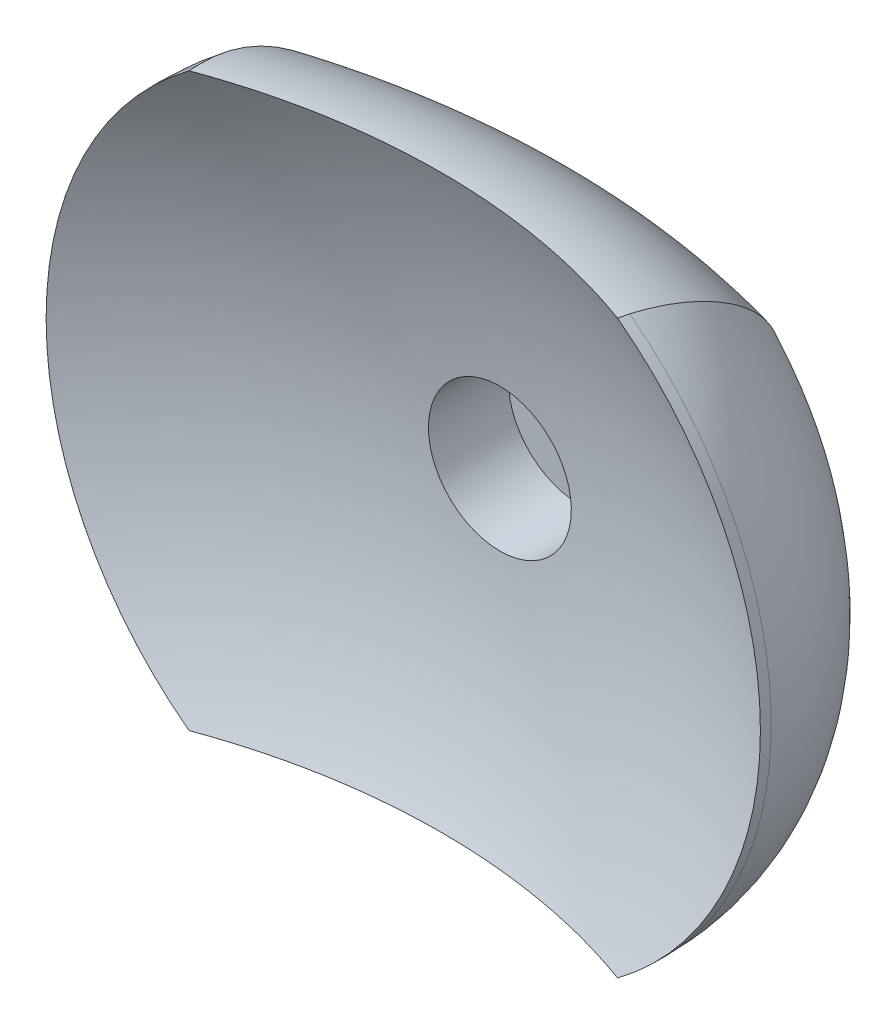
ISO-10303-21;
HEADER;
FILE_DESCRIPTION(('STEP AP214'),'2;1');
FILE_NAME('part.step','',(''),(''),'','','');
FILE_SCHEMA(('AUTOMOTIVE_DESIGN { 1 0 10303 214 1 1 1 1 }'));
ENDSEC;
DATA;
#1=APPLICATION_CONTEXT('core data for automotive mechanical design processes');
#2=APPLICATION_PROTOCOL_DEFINITION('international standard','automotive_design',2000,#1);
#3=PRODUCT_CONTEXT('',#1,'mechanical');
#4=PRODUCT('Part','Part','',(#3));
#5=PRODUCT_RELATED_PRODUCT_CATEGORY('part','',(#4));
#6=PRODUCT_DEFINITION_FORMATION('','',#4);
#7=PRODUCT_DEFINITION_CONTEXT('part definition',#1,'design');
#8=PRODUCT_DEFINITION('design','',#6,#7);
#9=PRODUCT_DEFINITION_SHAPE('','',#8);
#10=(LENGTH_UNIT() NAMED_UNIT(*) SI_UNIT(.MILLI.,.METRE.));
#11=(NAMED_UNIT(*) PLANE_ANGLE_UNIT() SI_UNIT($,.RADIAN.));
#12=(NAMED_UNIT(*) SI_UNIT($,.STERADIAN.) SOLID_ANGLE_UNIT());
#13=UNCERTAINTY_MEASURE_WITH_UNIT(LENGTH_MEASURE(1.E-05),#10,'distance_accuracy_value','');
#14=(GEOMETRIC_REPRESENTATION_CONTEXT(3) GLOBAL_UNCERTAINTY_ASSIGNED_CONTEXT((#13)) GLOBAL_UNIT_ASSIGNED_CONTEXT((#10,
#11,#12)) REPRESENTATION_CONTEXT('',''));
#15=CARTESIAN_POINT('',(0.,0.,0.));
#16=DIRECTION('',(0.,0.,1.));
#17=DIRECTION('',(1.,0.,0.));
#18=AXIS2_PLACEMENT_3D('',#15,#16,#17);
#19=CARTESIAN_POINT('',(0.,0.,85.));
#20=DIRECTION('',(0.,0.,1.));
#21=DIRECTION('',(0.,1.,0.));
#22=AXIS2_PLACEMENT_3D('',#19,#20,#21);
#23=SPHERICAL_SURFACE('',#22,85.);
#24=CARTESIAN_POINT('',(0.,0.,3.13856598679557));
#25=DIRECTION('',(0.,0.,1.));
#26=DIRECTION('',(0.,-1.,0.));
#27=AXIS2_PLACEMENT_3D('',#24,#25,#26);
#28=CIRCLE('',#27,22.8846153846153);
#29=CARTESIAN_POINT('',(-18.7456166701098,-13.1265942635199,3.13856598679554));
#30=VERTEX_POINT('',#29);
#31=CARTESIAN_POINT('',(-18.7456166701099,13.1265942635199,3.13856598679554));
#32=VERTEX_POINT('',#31);
#33=EDGE_CURVE('E272',#30,#32,#28,.F.);
#34=ORIENTED_EDGE('',*,*,#33,.T.);
#35=CARTESIAN_POINT('',(0.,13.1265942635199,85.));
#36=DIRECTION('',(0.,-1.,0.));
#37=DIRECTION('',(0.,0.,-1.));
#38=AXIS2_PLACEMENT_3D('',#35,#36,#37);
#39=CIRCLE('',#38,83.9803103295108);
#40=CARTESIAN_POINT('',(-7.25896156767112,13.1265942635199,1.33399734659243));
#41=VERTEX_POINT('',#40);
#42=EDGE_CURVE('E277',#32,#41,#39,.T.);
#43=ORIENTED_EDGE('',*,*,#42,.T.);
#44=CARTESIAN_POINT('',(0.,0.,1.33399734659242));
#45=DIRECTION('',(0.,0.,1.));
#46=DIRECTION('',(0.,-1.,0.));
#47=AXIS2_PLACEMENT_3D('',#44,#45,#46);
#48=CIRCLE('',#47,15.);
#49=CARTESIAN_POINT('',(-7.25896156767107,-13.1265942635199,1.33399734659243));
#50=VERTEX_POINT('',#49);
#51=EDGE_CURVE('E147',#41,#50,#48,.T.);
#52=ORIENTED_EDGE('',*,*,#51,.T.);
#53=CARTESIAN_POINT('',(0.,-13.1265942635199,85.));
#54=DIRECTION('',(0.,1.,0.));
#55=DIRECTION('',(0.,0.,1.));
#56=AXIS2_PLACEMENT_3D('',#53,#54,#55);
#57=CIRCLE('',#56,83.9803103295108);
#58=EDGE_CURVE('E275',#50,#30,#57,.T.);
#59=ORIENTED_EDGE('',*,*,#58,.T.);
#60=EDGE_LOOP('',(#34,#43,#52,#59));
#61=FACE_BOUND('',#60,.T.);
#62=ADVANCED_FACE('F41',(#61),#23,.T.);
#63=CARTESIAN_POINT('',(0.,0.,85.));
#64=DIRECTION('',(0.,0.,1.));
#65=DIRECTION('',(0.,1.,0.));
#66=AXIS2_PLACEMENT_3D('',#63,#64,#65);
#67=SPHERICAL_SURFACE('',#66,72.);
#68=CARTESIAN_POINT('',(0.,-30.,85.));
#69=DIRECTION('',(0.,1.,0.));
#70=DIRECTION('',(0.,0.,1.));
#71=AXIS2_PLACEMENT_3D('',#68,#69,#70);
#72=CIRCLE('',#71,65.4522726878143);
#73=CARTESIAN_POINT('',(22.4999999999999,-30.,23.5365962543564));
#74=VERTEX_POINT('',#73);
#75=CARTESIAN_POINT('',(-22.4999999999999,-30.,23.5365962543564));
#76=VERTEX_POINT('',#75);
#77=EDGE_CURVE('E137',#74,#76,#72,.T.);
#78=ORIENTED_EDGE('',*,*,#77,.F.);
#79=CARTESIAN_POINT('',(0.,0.,23.5365962543564));
#80=DIRECTION('',(0.,0.,1.));
#81=DIRECTION('',(0.,-1.,0.));
#82=AXIS2_PLACEMENT_3D('',#79,#80,#81);
#83=CIRCLE('',#82,37.5);
#84=CARTESIAN_POINT('',(22.5,30.,23.5365962543564));
#85=VERTEX_POINT('',#84);
#86=EDGE_CURVE('E135',#74,#85,#83,.T.);
#87=ORIENTED_EDGE('',*,*,#86,.T.);
#88=CARTESIAN_POINT('',(0.,30.,85.));
#89=DIRECTION('',(0.,1.,0.));
#90=DIRECTION('',(0.,0.,1.));
#91=AXIS2_PLACEMENT_3D('',#88,#89,#90);
#92=CIRCLE('',#91,65.4522726878143);
#93=CARTESIAN_POINT('',(-22.5,30.,23.5365962543564));
#94=VERTEX_POINT('',#93);
#95=EDGE_CURVE('E117',#85,#94,#92,.T.);
#96=ORIENTED_EDGE('',*,*,#95,.T.);
#97=EDGE_CURVE('E133',#94,#76,#83,.T.);
#98=ORIENTED_EDGE('',*,*,#97,.T.);
#99=EDGE_LOOP('',(#78,#87,#96,#98));
#100=FACE_BOUND('',#99,.T.);
#101=CARTESIAN_POINT('',(0.,0.,13.39169042632));
#102=DIRECTION('',(0.,0.,1.));
#103=DIRECTION('',(0.,-1.,0.));
#104=AXIS2_PLACEMENT_3D('',#101,#102,#103);
#105=CIRCLE('',#104,7.49999999999997);
#106=CARTESIAN_POINT('',(0.,-7.49999999999995,13.39169042632));
#107=VERTEX_POINT('',#106);
#108=EDGE_CURVE('E164',#107,#107,#105,.T.);
#109=ORIENTED_EDGE('',*,*,#108,.F.);
#110=EDGE_LOOP('',(#109));
#111=FACE_BOUND('',#110,.T.);
#112=ADVANCED_FACE('F131',(#100,#111),#67,.F.);
#113=CARTESIAN_POINT('',(7.25896156767107,-13.1265942635199,1.33399734659243));
#114=VERTEX_POINT('',#113);
#115=CARTESIAN_POINT('',(7.25896156767112,13.1265942635199,1.33399734659243));
#116=VERTEX_POINT('',#115);
#117=EDGE_CURVE('E152',#114,#116,#48,.T.);
#118=ORIENTED_EDGE('',*,*,#117,.T.);
#119=CARTESIAN_POINT('',(0.,13.1265942635199,85.));
#120=DIRECTION('',(0.,-1.,0.));
#121=DIRECTION('',(0.,0.,-1.));
#122=AXIS2_PLACEMENT_3D('',#119,#120,#121);
#123=CIRCLE('',#122,83.9803103295108);
#124=CARTESIAN_POINT('',(18.7456166701099,13.1265942635199,3.13856598679555));
#125=VERTEX_POINT('',#124);
#126=EDGE_CURVE('E262',#116,#125,#123,.T.);
#127=ORIENTED_EDGE('',*,*,#126,.T.);
#128=CARTESIAN_POINT('',(0.,0.,3.13856598679557));
#129=DIRECTION('',(0.,0.,1.));
#130=DIRECTION('',(0.,-1.,0.));
#131=AXIS2_PLACEMENT_3D('',#128,#129,#130);
#132=CIRCLE('',#131,22.8846153846153);
#133=CARTESIAN_POINT('',(18.7456166701098,-13.1265942635199,3.13856598679552));
#134=VERTEX_POINT('',#133);
#135=EDGE_CURVE('E125',#125,#134,#132,.F.);
#136=ORIENTED_EDGE('',*,*,#135,.T.);
#137=CARTESIAN_POINT('',(0.,-13.1265942635199,85.));
#138=DIRECTION('',(0.,1.,0.));
#139=DIRECTION('',(0.,0.,1.));
#140=AXIS2_PLACEMENT_3D('',#137,#138,#139);
#141=CIRCLE('',#140,83.9803103295108);
#142=EDGE_CURVE('E266',#134,#114,#141,.T.);
#143=ORIENTED_EDGE('',*,*,#142,.T.);
#144=EDGE_LOOP('',(#118,#127,#136,#143));
#145=FACE_BOUND('',#144,.T.);
#146=ADVANCED_FACE('F188',(#145),#23,.T.);
#147=CARTESIAN_POINT('',(0.,0.,157.));
#148=DIRECTION('',(0.,0.,1.));
#149=DIRECTION('',(0.,-1.,0.));
#150=AXIS2_PLACEMENT_3D('',#147,#148,#149);
#151=CYLINDRICAL_SURFACE('',#150,37.5);
#152=ORIENTED_EDGE('',*,*,#97,.F.);
#153=CARTESIAN_POINT('',(-22.5,30.,23.5365962543564));
#154=CARTESIAN_POINT('',(-22.5075786574458,29.9943157546282,23.4412890358775));
#155=CARTESIAN_POINT('',(-22.5160235070375,29.9879778810972,23.3460891070091));
#156=CARTESIAN_POINT('',(-22.5346500631485,29.9739834850237,23.1560086355064));
#157=CARTESIAN_POINT('',(-22.5448308310329,29.966327675086,23.0611279483786));
#158=CARTESIAN_POINT('',(-22.5669418791486,29.9496798933839,22.8716876280121));
#159=CARTESIAN_POINT('',(-22.5788721645719,29.940687917654,22.777127995727));
#160=CARTESIAN_POINT('',(-22.6044910180737,29.9213509008218,22.5883336130364));
#161=CARTESIAN_POINT('',(-22.6181805309192,29.9110051326303,22.4940990653406));
#162=CARTESIAN_POINT('',(-22.6327476215287,29.8999788478217,22.4000798722554));
#163=B_SPLINE_CURVE_WITH_KNOTS('',3,(#153,#154,#155,#156,#157,#158,#159,#160,#161,#162),
.UNSPECIFIED.,.F.,.F.,(4,2,2,2,4),(0.,0.287325297466584,0.574495724025849,0.861667002835191,
1.14899315228859),.UNSPECIFIED.);
#164=CARTESIAN_POINT('',(-22.6327476215287,29.8999788478217,22.4000798722554));
#165=VERTEX_POINT('',#164);
#166=EDGE_CURVE('E113',#94,#165,#163,.T.);
#167=ORIENTED_EDGE('',*,*,#166,.T.);
#168=CARTESIAN_POINT('',(0.,0.,22.4000798722554));
#169=DIRECTION('',(0.,0.,1.));
#170=DIRECTION('',(0.,-1.,0.));
#171=AXIS2_PLACEMENT_3D('',#168,#169,#170);
#172=CIRCLE('',#171,37.5);
#173=CARTESIAN_POINT('',(-22.6327476215286,-29.8999788478217,22.4000798722554));
#174=VERTEX_POINT('',#173);
#175=EDGE_CURVE('E168',#165,#174,#172,.T.);
#176=ORIENTED_EDGE('',*,*,#175,.T.);
#177=CARTESIAN_POINT('',(-22.6327476215286,-29.8999788478217,22.4000798722554));
#178=CARTESIAN_POINT('',(-22.6181805309192,-29.9110051326303,22.4940990653406));
#179=CARTESIAN_POINT('',(-22.6044910180737,-29.9213509008218,22.5883336130364));
#180=CARTESIAN_POINT('',(-22.5788721645718,-29.9406879176541,22.777127995727));
#181=CARTESIAN_POINT('',(-22.5669418791485,-29.9496798933839,22.8716876280121));
#182=CARTESIAN_POINT('',(-22.5448308310329,-29.966327675086,23.0611279483786));
#183=CARTESIAN_POINT('',(-22.5346500631485,-29.9739834850237,23.1560086355064));
#184=CARTESIAN_POINT('',(-22.5160235070375,-29.9879778810972,23.3460891070091));
#185=CARTESIAN_POINT('',(-22.5075786574457,-29.9943157546282,23.4412890358775));
#186=CARTESIAN_POINT('',(-22.4999999999999,-30.,23.5365962543564));
#187=B_SPLINE_CURVE_WITH_KNOTS('',3,(#177,#178,#179,#180,#181,#182,#183,#184,#185,#186),
.UNSPECIFIED.,.F.,.F.,(4,2,2,2,4),(0.,0.287326149453408,0.57449742826275,0.861667854822012,
1.1489931522886),.UNSPECIFIED.);
#188=EDGE_CURVE('E126',#174,#76,#187,.T.);
#189=ORIENTED_EDGE('',*,*,#188,.T.);
#190=EDGE_LOOP('',(#152,#167,#176,#189));
#191=FACE_BOUND('',#190,.T.);
#192=ADVANCED_FACE('F140',(#191),#151,.T.);
#193=CARTESIAN_POINT('',(0.,0.,22.4000798722554));
#194=DIRECTION('',(0.,0.,1.));
#195=DIRECTION('',(0.,-1.,0.));
#196=AXIS2_PLACEMENT_3D('',#193,#194,#195);
#197=CIRCLE('',#196,37.5);
#198=CARTESIAN_POINT('',(22.6327476215286,-29.8999788478217,22.4000798722554));
#199=VERTEX_POINT('',#198);
#200=CARTESIAN_POINT('',(22.6327476215287,29.8999788478217,22.4000798722554));
#201=VERTEX_POINT('',#200);
#202=EDGE_CURVE('E64',#199,#201,#197,.T.);
#203=ORIENTED_EDGE('',*,*,#202,.T.);
#204=CARTESIAN_POINT('',(22.6327476215287,29.8999788478217,22.4000798722554));
#205=CARTESIAN_POINT('',(22.6181805309192,29.9110051326303,22.4940990653406));
#206=CARTESIAN_POINT('',(22.6044910180737,29.9213509008218,22.5883336130364));
#207=CARTESIAN_POINT('',(22.5788721645719,29.940687917654,22.777127995727));
#208=CARTESIAN_POINT('',(22.5669418791486,29.9496798933839,22.8716876280121));
#209=CARTESIAN_POINT('',(22.5448308310329,29.966327675086,23.0611279483786));
#210=CARTESIAN_POINT('',(22.5346500631485,29.9739834850237,23.1560086355064));
#211=CARTESIAN_POINT('',(22.5160235070375,29.9879778810972,23.3460891070091));
#212=CARTESIAN_POINT('',(22.5075786574458,29.9943157546282,23.4412890358775));
#213=CARTESIAN_POINT('',(22.5,30.,23.5365962543564));
#214=B_SPLINE_CURVE_WITH_KNOTS('',3,(#204,#205,#206,#207,#208,#209,#210,#211,#212,#213),
.UNSPECIFIED.,.F.,.F.,(4,2,2,2,4),(0.,0.287326149453409,0.574497428262761,0.861667854822035,
1.14899315228863),.UNSPECIFIED.);
#215=EDGE_CURVE('E202',#201,#85,#214,.T.);
#216=ORIENTED_EDGE('',*,*,#215,.T.);
#217=ORIENTED_EDGE('',*,*,#86,.F.);
#218=CARTESIAN_POINT('',(22.4999999999999,-30.,23.5365962543564));
#219=CARTESIAN_POINT('',(22.5075786574457,-29.9943157546282,23.4412890358775));
#220=CARTESIAN_POINT('',(22.5160235070374,-29.9879778810972,23.3460891070091));
#221=CARTESIAN_POINT('',(22.5346500631485,-29.9739834850237,23.1560086355064));
#222=CARTESIAN_POINT('',(22.5448308310329,-29.966327675086,23.0611279483786));
#223=CARTESIAN_POINT('',(22.5669418791485,-29.9496798933839,22.8716876280121));
#224=CARTESIAN_POINT('',(22.5788721645718,-29.940687917654,22.777127995727));
#225=CARTESIAN_POINT('',(22.6044910180737,-29.9213509008218,22.5883336130364));
#226=CARTESIAN_POINT('',(22.6181805309192,-29.9110051326303,22.4940990653406));
#227=CARTESIAN_POINT('',(22.6327476215286,-29.8999788478217,22.4000798722554));
#228=B_SPLINE_CURVE_WITH_KNOTS('',3,(#218,#219,#220,#221,#222,#223,#224,#225,#226,#227),
.UNSPECIFIED.,.F.,.F.,(4,2,2,2,4),(0.,0.287325297466597,0.574495724025867,0.861667002835222,
1.14899315228863),.UNSPECIFIED.);
#229=EDGE_CURVE('E69',#74,#199,#228,.T.);
#230=ORIENTED_EDGE('',*,*,#229,.T.);
#231=EDGE_LOOP('',(#203,#216,#217,#230));
#232=FACE_BOUND('',#231,.T.);
#233=ADVANCED_FACE('F187',(#232),#151,.T.);
#234=CARTESIAN_POINT('',(0.,0.,157.));
#235=DIRECTION('',(0.,0.,1.));
#236=DIRECTION('',(0.,-1.,0.));
#237=AXIS2_PLACEMENT_3D('',#234,#235,#236);
#238=CYLINDRICAL_SURFACE('',#237,7.49999999999997);
#239=ORIENTED_EDGE('',*,*,#108,.T.);
#240=EDGE_LOOP('',(#239));
#241=FACE_BOUND('',#240,.T.);
#242=CARTESIAN_POINT('',(0.,0.,5.));
#243=DIRECTION('',(0.,0.,1.));
#244=DIRECTION('',(0.,-1.,0.));
#245=AXIS2_PLACEMENT_3D('',#242,#243,#244);
#246=CIRCLE('',#245,7.49999999999997);
#247=CARTESIAN_POINT('',(0.,-7.49999999999994,5.));
#248=VERTEX_POINT('',#247);
#249=EDGE_CURVE('E160',#248,#248,#246,.T.);
#250=ORIENTED_EDGE('',*,*,#249,.F.);
#251=EDGE_LOOP('',(#250));
#252=FACE_BOUND('',#251,.T.);
#253=ADVANCED_FACE('F315',(#241,#252),#238,.F.);
#254=CARTESIAN_POINT('',(0.,0.,5.));
#255=DIRECTION('',(0.,0.,1.));
#256=DIRECTION('',(0.,-1.,0.));
#257=AXIS2_PLACEMENT_3D('',#254,#255,#256);
#258=PLANE('',#257);
#259=CARTESIAN_POINT('',(0.,0.,5.));
#260=DIRECTION('',(0.,0.,1.));
#261=DIRECTION('',(0.,-1.,0.));
#262=AXIS2_PLACEMENT_3D('',#259,#260,#261);
#263=CIRCLE('',#262,4.25);
#264=CARTESIAN_POINT('',(0.,-4.24999999999998,5.));
#265=VERTEX_POINT('',#264);
#266=EDGE_CURVE('E143',#265,#265,#263,.F.);
#267=ORIENTED_EDGE('',*,*,#266,.T.);
#268=EDGE_LOOP('',(#267));
#269=FACE_BOUND('',#268,.T.);
#270=ORIENTED_EDGE('',*,*,#249,.T.);
#271=EDGE_LOOP('',(#270));
#272=FACE_BOUND('',#271,.T.);
#273=ADVANCED_FACE('F322',(#269,#272),#258,.T.);
#274=CARTESIAN_POINT('',(0.,0.,0.));
#275=DIRECTION('',(0.,0.,1.));
#276=DIRECTION('',(0.,-1.,0.));
#277=AXIS2_PLACEMENT_3D('',#274,#275,#276);
#278=PLANE('',#277);
#279=CARTESIAN_POINT('',(0.,0.,0.));
#280=DIRECTION('',(0.,0.,1.));
#281=DIRECTION('',(1.,0.,0.));
#282=AXIS2_PLACEMENT_3D('',#279,#280,#281);
#283=CIRCLE('',#282,4.25);
#284=CARTESIAN_POINT('',(4.25,0.,0.));
#285=VERTEX_POINT('',#284);
#286=EDGE_CURVE('E138',#285,#285,#283,.T.);
#287=ORIENTED_EDGE('',*,*,#286,.T.);
#288=EDGE_LOOP('',(#287));
#289=FACE_BOUND('',#288,.T.);
#290=CARTESIAN_POINT('',(0.,0.,0.));
#291=DIRECTION('',(0.,0.,1.));
#292=DIRECTION('',(0.,-1.,0.));
#293=AXIS2_PLACEMENT_3D('',#290,#291,#292);
#294=CIRCLE('',#293,15.);
#295=CARTESIAN_POINT('',(0.,-14.9999999999999,0.));
#296=VERTEX_POINT('',#295);
#297=EDGE_CURVE('E156',#296,#296,#294,.T.);
#298=ORIENTED_EDGE('',*,*,#297,.F.);
#299=EDGE_LOOP('',(#298));
#300=FACE_BOUND('',#299,.T.);
#301=ADVANCED_FACE('F330',(#289,#300),#278,.F.);
#302=CARTESIAN_POINT('',(0.,0.,157.));
#303=DIRECTION('',(0.,0.,1.));
#304=DIRECTION('',(0.,-1.,0.));
#305=AXIS2_PLACEMENT_3D('',#302,#303,#304);
#306=CYLINDRICAL_SURFACE('',#305,15.);
#307=ORIENTED_EDGE('',*,*,#117,.F.);
#308=CARTESIAN_POINT('',(7.25896156767107,-13.1265942635199,1.33399734659243));
#309=CARTESIAN_POINT('',(6.8898376187166,-13.3307698815347,1.33403933442097));
#310=CARTESIAN_POINT('',(6.51208017733204,-13.5192857777159,1.33648862070695));
#311=CARTESIAN_POINT('',(5.74208810214011,-13.8638360280483,1.34426800413037));
#312=CARTESIAN_POINT('',(5.349854468572,-14.0198726214439,1.34959790257648));
#313=CARTESIAN_POINT('',(4.55427113724967,-14.298112760777,1.36119618094274));
#314=CARTESIAN_POINT('',(4.15093979621784,-14.4203688716808,1.36746307913064));
#315=CARTESIAN_POINT('',(3.33541856799858,-14.6305250636724,1.37939346483196));
#316=CARTESIAN_POINT('',(2.92322877442464,-14.7184255076325,1.38505695871821));
#317=CARTESIAN_POINT('',(2.09254960679961,-14.8593020481076,1.39460448709478));
#318=CARTESIAN_POINT('',(1.67405529043004,-14.912249111697,1.39848704148904));
#319=CARTESIAN_POINT('',(0.834073210653535,-14.9827218938418,1.40373343047867));
#320=CARTESIAN_POINT('',(0.412585412452513,-15.0002472000018,1.40509723574966));
#321=CARTESIAN_POINT('',(-0.430365833314991,-14.9997475309416,1.40505893280728));
#322=CARTESIAN_POINT('',(-0.851829281034996,-14.9817228117768,1.40365684451577));
#323=CARTESIAN_POINT('',(-1.69172028488296,-14.910255302856,1.39834089705629));
#324=CARTESIAN_POINT('',(-2.1101478812991,-14.8568129839923,1.39442707128299));
#325=CARTESIAN_POINT('',(-2.93920396047822,-14.7152016466698,1.38484752285413));
#326=CARTESIAN_POINT('',(-3.34985829280186,-14.6271833613189,1.37918942704287));
#327=CARTESIAN_POINT('',(-4.16233926651662,-14.4170396069438,1.36728880157382));
#328=CARTESIAN_POINT('',(-4.5641658471254,-14.2949139031567,1.36104626789353));
#329=CARTESIAN_POINT('',(-5.35678891223954,-14.0171799222553,1.34950271717559));
#330=CARTESIAN_POINT('',(-5.74756744777831,-13.861520345579,1.34420316563383));
#331=CARTESIAN_POINT('',(-6.51474270637578,-13.5179564524807,1.33647105151755));
#332=CARTESIAN_POINT('',(-6.89113839778211,-13.3300498283312,1.33403869422897));
#333=CARTESIAN_POINT('',(-7.25896156767107,-13.1265942635199,1.33399734659242));
#334=B_SPLINE_CURVE_WITH_KNOTS('',3,(#308,#309,#310,#311,#312,#313,#314,#315,#316,#317,#318,
#319,#320,#321,#322,#323,#324,#325,#326,#327,#328,#329,#330,#331,#332,#333),.UNSPECIFIED.,.F.,
.F.,(4,2,2,2,2,2,2,2,2,2,2,2,4),(0.,1.26507363474501,2.53006002168234,3.79306676502517,
5.05606016784608,6.32010132085377,7.58415719029101,8.84820395517009,10.1122339143384,
11.3708134514812,12.6294016516964,13.8899290674015,15.1505467291223),.UNSPECIFIED.);
#335=EDGE_CURVE('E11',#114,#50,#334,.T.);
#336=ORIENTED_EDGE('',*,*,#335,.T.);
#337=ORIENTED_EDGE('',*,*,#51,.F.);
#338=CARTESIAN_POINT('',(-7.25896156767112,13.1265942635199,1.33399734659243));
#339=CARTESIAN_POINT('',(-6.88983761871666,13.3307698815347,1.33403933442098));
#340=CARTESIAN_POINT('',(-6.5120801773321,13.5192857777159,1.33648862070696));
#341=CARTESIAN_POINT('',(-5.74208810214017,13.8638360280484,1.34426800413039));
#342=CARTESIAN_POINT('',(-5.34985446857207,14.0198726214439,1.3495979025765));
#343=CARTESIAN_POINT('',(-4.55427113724973,14.298112760777,1.36119618094276));
#344=CARTESIAN_POINT('',(-4.15093979621791,14.4203688716809,1.36746307913065));
#345=CARTESIAN_POINT('',(-3.33541856799865,14.6305250636724,1.37939346483197));
#346=CARTESIAN_POINT('',(-2.92322877442471,14.7184255076325,1.38505695871822));
#347=CARTESIAN_POINT('',(-2.09254960679968,14.8593020481077,1.39460448709479));
#348=CARTESIAN_POINT('',(-1.67405529043011,14.9122491116971,1.39848704148904));
#349=CARTESIAN_POINT('',(-0.834073210653605,14.9827218938419,1.40373343047867));
#350=CARTESIAN_POINT('',(-0.412585412452583,15.0002472000019,1.40509723574967));
#351=CARTESIAN_POINT('',(0.430365833314921,14.9997475309416,1.4050589328073));
#352=CARTESIAN_POINT('',(0.851829281034926,14.9817228117769,1.40365684451579));
#353=CARTESIAN_POINT('',(1.69172028488289,14.9102553028561,1.39834089705632));
#354=CARTESIAN_POINT('',(2.11014788129903,14.8568129839924,1.39442707128302));
#355=CARTESIAN_POINT('',(2.93920396047816,14.7152016466699,1.38484752285415));
#356=CARTESIAN_POINT('',(3.34985829280181,14.627183361319,1.37918942704287));
#357=CARTESIAN_POINT('',(4.1623392665166,14.4170396069438,1.36728880157383));
#358=CARTESIAN_POINT('',(4.56416584712538,14.2949139031567,1.36104626789355));
#359=CARTESIAN_POINT('',(5.35678891223955,14.0171799222553,1.34950271717561));
#360=CARTESIAN_POINT('',(5.74756744777832,13.8615203455791,1.34420316563384));
#361=CARTESIAN_POINT('',(6.51474270637582,13.5179564524807,1.33647105151755));
#362=CARTESIAN_POINT('',(6.89113839778215,13.3300498283313,1.33403869422897));
#363=CARTESIAN_POINT('',(7.25896156767112,13.1265942635199,1.33399734659242));
#364=B_SPLINE_CURVE_WITH_KNOTS('',3,(#338,#339,#340,#341,#342,#343,#344,#345,#346,#347,#348,
#349,#350,#351,#352,#353,#354,#355,#356,#357,#358,#359,#360,#361,#362,#363),.UNSPECIFIED.,.F.,
.F.,(4,2,2,2,2,2,2,2,2,2,2,2,4),(0.,1.26507363474502,2.53006002168234,3.79306676502517,
5.05606016784608,6.32010132085377,7.58415719029101,8.84820395517008,10.1122339143384,
11.3708134514812,12.6294016516965,13.8899290674016,15.1505467291224),.UNSPECIFIED.);
#365=EDGE_CURVE('E56',#41,#116,#364,.T.);
#366=ORIENTED_EDGE('',*,*,#365,.T.);
#367=EDGE_LOOP('',(#307,#336,#337,#366));
#368=FACE_BOUND('',#367,.T.);
#369=ORIENTED_EDGE('',*,*,#297,.T.);
#370=EDGE_LOOP('',(#369));
#371=FACE_BOUND('',#370,.T.);
#372=ADVANCED_FACE('F287',(#368,#371),#306,.T.);
#373=CARTESIAN_POINT('',(0.,0.,23.5365962543564));
#374=DIRECTION('',(0.,0.,-1.));
#375=DIRECTION('',(-1.,0.,0.));
#376=AXIS2_PLACEMENT_3D('',#373,#374,#375);
#377=CYLINDRICAL_SURFACE('',#376,4.25);
#378=ORIENTED_EDGE('',*,*,#266,.F.);
#379=EDGE_LOOP('',(#378));
#380=FACE_BOUND('',#379,.T.);
#381=ORIENTED_EDGE('',*,*,#286,.F.);
#382=EDGE_LOOP('',(#381));
#383=FACE_BOUND('',#382,.T.);
#384=ADVANCED_FACE('F189',(#380,#383),#377,.F.);
#385=CARTESIAN_POINT('',(0.,-10.037983848574,85.));
#386=DIRECTION('',(0.,1.,0.));
#387=DIRECTION('',(0.,0.,1.));
#388=AXIS2_PLACEMENT_3D('',#385,#386,#387);
#389=TOROIDAL_SURFACE('',#388,64.2202373108023,20.);
#390=ORIENTED_EDGE('',*,*,#335,.F.);
#391=ORIENTED_EDGE('',*,*,#142,.F.);
#392=CARTESIAN_POINT('',(22.6327476215286,-29.8999788478217,22.4000798722554));
#393=CARTESIAN_POINT('',(22.6759566495804,-29.8672724745487,22.1211825982407));
#394=CARTESIAN_POINT('',(22.7169029045424,-29.8288127837425,21.8426454900375));
#395=CARTESIAN_POINT('',(22.7941613758431,-29.7405412943046,21.2867433344392));
#396=CARTESIAN_POINT('',(22.8304738144506,-29.6907300404893,21.0093782314444));
#397=CARTESIAN_POINT('',(22.932271545271,-29.5245474593386,20.1799393854189));
#398=CARTESIAN_POINT('',(22.9906582347076,-29.3913961488839,19.6302580387353));
#399=CARTESIAN_POINT('',(23.0875625317697,-29.0823467195585,18.5426227338799));
#400=CARTESIAN_POINT('',(23.126124414548,-28.9065451573037,18.0046452354458));
#401=CARTESIAN_POINT('',(23.1687472751705,-28.6121926100601,17.2083605462905));
#402=CARTESIAN_POINT('',(23.1804185255721,-28.5089582333219,16.9446940704918));
#403=CARTESIAN_POINT('',(23.1986302522641,-28.2925015540193,16.4212395194075));
#404=CARTESIAN_POINT('',(23.2051695066435,-28.1792768799331,16.1614523822143));
#405=CARTESIAN_POINT('',(23.2169871405358,-27.8252396790899,15.3890231374024));
#406=CARTESIAN_POINT('',(23.2144914046119,-27.5698848486863,14.8828297828627));
#407=CARTESIAN_POINT('',(23.188392911793,-27.0228623066885,13.8910280789035));
#408=CARTESIAN_POINT('',(23.1647895056516,-26.7311934783571,13.4054203631544));
#409=CARTESIAN_POINT('',(23.1134110848656,-26.268462169488,12.6946493257159));
#410=CARTESIAN_POINT('',(23.0936162507026,-26.10997384958,12.4606132586676));
#411=CARTESIAN_POINT('',(23.0486925610589,-25.7849624897467,11.9988040977782));
#412=CARTESIAN_POINT('',(23.0235650654631,-25.6184415065849,11.7710294239108));
#413=CARTESIAN_POINT('',(22.9401555914133,-25.1072545875199,11.0974528322839));
#414=CARTESIAN_POINT('',(22.8738445269275,-24.7509456703859,10.6613691912472));
#415=CARTESIAN_POINT('',(22.7174750483262,-23.9988157642278,9.80457313131419));
#416=CARTESIAN_POINT('',(22.6267405893716,-23.6021091282672,9.38476409536921));
#417=CARTESIAN_POINT('',(22.4227485131364,-22.7822493964378,8.57770470296028));
#418=CARTESIAN_POINT('',(22.3094901898653,-22.3590954718873,8.19045536759281));
#419=CARTESIAN_POINT('',(22.0606402654043,-21.4894069658244,7.45020783952135));
#420=CARTESIAN_POINT('',(21.9250330532118,-21.042856191075,7.0972338644703));
#421=CARTESIAN_POINT('',(21.7052792503349,-20.3584970309075,6.59505187179281));
#422=CARTESIAN_POINT('',(21.6293020254249,-20.1279491347515,6.43220059856233));
#423=CARTESIAN_POINT('',(21.4719308413826,-19.6623536296779,6.11568961805538));
#424=CARTESIAN_POINT('',(21.390535697338,-19.4273050445084,5.96203193548495));
#425=CARTESIAN_POINT('',(21.1361669095546,-18.7100171971833,5.51130440325042));
#426=CARTESIAN_POINT('',(20.9548826839091,-18.2214850979531,5.22876850859643));
#427=CARTESIAN_POINT('',(20.5709962899891,-17.2316584949695,4.70333821724956));
#428=CARTESIAN_POINT('',(20.3683936897881,-16.730363732791,4.46044462399445));
#429=CARTESIAN_POINT('',(20.0492663274654,-15.9722238650415,4.12662182976191));
#430=CARTESIAN_POINT('',(19.9404599435346,-15.7187127402347,4.0205171230681));
#431=CARTESIAN_POINT('',(19.7178248187729,-15.2099489730784,3.81842639986927));
#432=CARTESIAN_POINT('',(19.6039970185255,-14.9546966643867,3.72243849966134));
#433=CARTESIAN_POINT('',(19.2551690867408,-14.1871328386299,3.44976544864672));
#434=CARTESIAN_POINT('',(19.0126776569372,-13.6726650650371,3.28821752707189));
#435=CARTESIAN_POINT('',(18.7557300938624,-13.1472519930036,3.14420344059223));
#436=CARTESIAN_POINT('',(18.7506752704379,-13.1369232431551,3.14138061880152));
#437=CARTESIAN_POINT('',(18.7456166701098,-13.1265942635199,3.13856598679553));
#438=B_SPLINE_CURVE_WITH_KNOTS('',3,(#392,#393,#394,#395,#396,#397,#398,#399,#400,#401,#402,
#403,#404,#405,#406,#407,#408,#409,#410,#411,#412,#413,#414,#415,#416,#417,#418,#419,#420,#421,
#422,#423,#424,#425,#426,#427,#428,#429,#430,#431,#432,#433,#434,#435,#436,#437),.UNSPECIFIED.,
.F.,.F.,(4,2,2,2,2,2,2,2,2,2,2,2,2,2,2,2,2,2,2,2,2,2,4),(0.,0.852203629380756,1.70436636600495,
3.4078874786595,5.10758737204026,5.95755910802829,6.80773315807195,8.50653763582346,
10.205394368547,11.0552188749776,11.9048269270431,13.6039387387589,15.3560348858445,
17.1081859594922,18.8615661625904,19.7383005766795,20.6152273687691,22.391488498771,
24.1677856241127,25.0543110418265,25.9406710998776,27.7121677294873,27.7476898694708),.UNSPECIFIED.);
#439=EDGE_CURVE('E46',#199,#134,#438,.T.);
#440=ORIENTED_EDGE('',*,*,#439,.F.);
#441=ORIENTED_EDGE('',*,*,#229,.F.);
#442=ORIENTED_EDGE('',*,*,#77,.T.);
#443=ORIENTED_EDGE('',*,*,#188,.F.);
#444=CARTESIAN_POINT('',(-22.6327476215286,-29.8999788478217,22.4000798722554));
#445=CARTESIAN_POINT('',(-22.6759566495804,-29.8672724745487,22.1211825982408));
#446=CARTESIAN_POINT('',(-22.7169029045424,-29.8288127837425,21.8426454900376));
#447=CARTESIAN_POINT('',(-22.7941613758431,-29.7405412943047,21.2867433344395));
#448=CARTESIAN_POINT('',(-22.8304738144506,-29.6907300404894,21.0093782314448));
#449=CARTESIAN_POINT('',(-22.932271545271,-29.5245474593387,20.1799393854195));
#450=CARTESIAN_POINT('',(-22.9906582347075,-29.3913961488841,19.630258038736));
#451=CARTESIAN_POINT('',(-23.0875625317696,-29.0823467195588,18.5426227338807));
#452=CARTESIAN_POINT('',(-23.1261244145479,-28.9065451573039,18.0046452354464));
#453=CARTESIAN_POINT('',(-23.1687472751704,-28.6121926100602,17.2083605462909));
#454=CARTESIAN_POINT('',(-23.1804185255721,-28.5089582333221,16.9446940704921));
#455=CARTESIAN_POINT('',(-23.1986302522641,-28.2925015540194,16.4212395194077));
#456=CARTESIAN_POINT('',(-23.2051695066435,-28.1792768799331,16.1614523822144));
#457=CARTESIAN_POINT('',(-23.2169871405358,-27.8252396790898,15.3890231374022));
#458=CARTESIAN_POINT('',(-23.2144914046119,-27.5698848486862,14.8828297828624));
#459=CARTESIAN_POINT('',(-23.188392911793,-27.0228623066882,13.8910280789029));
#460=CARTESIAN_POINT('',(-23.1647895056516,-26.7311934783567,13.4054203631537));
#461=CARTESIAN_POINT('',(-23.1134110848655,-26.2684621694874,12.6946493257151));
#462=CARTESIAN_POINT('',(-23.0936162507026,-26.1099738495795,12.4606132586668));
#463=CARTESIAN_POINT('',(-23.0486925610589,-25.7849624897463,11.9988040977776));
#464=CARTESIAN_POINT('',(-23.023565065463,-25.6184415065845,11.7710294239103));
#465=CARTESIAN_POINT('',(-22.9401555914133,-25.1072545875197,11.0974528322836));
#466=CARTESIAN_POINT('',(-22.8738445269275,-24.7509456703858,10.661369191247));
#467=CARTESIAN_POINT('',(-22.7174750483262,-23.9988157642281,9.8045731313146));
#468=CARTESIAN_POINT('',(-22.6267405893717,-23.6021091282679,9.38476409536996));
#469=CARTESIAN_POINT('',(-22.4227485131368,-22.7822493964392,8.57770470296163));
#470=CARTESIAN_POINT('',(-22.3094901898658,-22.3590954718891,8.19045536759442));
#471=CARTESIAN_POINT('',(-22.0606402654048,-21.4894069658261,7.45020783952276));
#472=CARTESIAN_POINT('',(-21.9250330532123,-21.0428561910764,7.09723386447131));
#473=CARTESIAN_POINT('',(-21.7052792503351,-20.3584970309082,6.59505187179336));
#474=CARTESIAN_POINT('',(-21.6293020254252,-20.1279491347521,6.43220059856278));
#475=CARTESIAN_POINT('',(-21.4719308413827,-19.6623536296783,6.11568961805561));
#476=CARTESIAN_POINT('',(-21.390535697338,-19.4273050445086,5.96203193548507));
#477=CARTESIAN_POINT('',(-21.1361669095544,-18.7100171971827,5.51130440325001));
#478=CARTESIAN_POINT('',(-20.9548826839088,-18.2214850979516,5.22876850859566));
#479=CARTESIAN_POINT('',(-20.5709962899877,-17.231658494967,4.70333821724815));
#480=CARTESIAN_POINT('',(-20.3683936897856,-16.7303637327883,4.46044462399273));
#481=CARTESIAN_POINT('',(-20.0492663274646,-15.9722238650375,4.12662182976047));
#482=CARTESIAN_POINT('',(-19.9404599435349,-15.7187127402303,4.02051712306696));
#483=CARTESIAN_POINT('',(-19.71782481877,-15.2099489730761,3.81842639986786));
#484=CARTESIAN_POINT('',(-19.6039970185182,-14.9546966643868,3.72243849965935));
#485=CARTESIAN_POINT('',(-19.2551690867516,-14.1871328386217,3.44976544864781));
#486=CARTESIAN_POINT('',(-19.0126776570018,-13.6726650650017,3.28821752708109));
#487=CARTESIAN_POINT('',(-18.7557300938651,-13.1472519930023,3.14420344059262));
#488=CARTESIAN_POINT('',(-18.7506752704393,-13.1369232431544,3.14138061880171));
#489=CARTESIAN_POINT('',(-18.7456166701098,-13.1265942635199,3.13856598679553));
#490=B_SPLINE_CURVE_WITH_KNOTS('',3,(#444,#445,#446,#447,#448,#449,#450,#451,#452,#453,#454,
#455,#456,#457,#458,#459,#460,#461,#462,#463,#464,#465,#466,#467,#468,#469,#470,#471,#472,#473,
#474,#475,#476,#477,#478,#479,#480,#481,#482,#483,#484,#485,#486,#487,#488,#489),.UNSPECIFIED.,
.F.,.F.,(4,2,2,2,2,2,2,2,2,2,2,2,2,2,2,2,2,2,2,2,2,2,4),(0.,0.852203629380533,1.70436636600449,
3.40788747865857,5.1075873720398,5.95755910802805,6.80773315807195,8.506537635824,
10.2053943685481,11.0552188749784,11.9048269270437,13.6039387387588,15.3560348858429,
17.1081859594894,18.8615661625893,19.7383005766789,20.615227368769,22.3914884987735,
24.1677856241172,25.0543110418302,25.9406710998811,27.7121677294873,27.7476898694708),.UNSPECIFIED.);
#491=EDGE_CURVE('E239',#30,#174,#490,.F.);
#492=ORIENTED_EDGE('',*,*,#491,.F.);
#493=ORIENTED_EDGE('',*,*,#58,.F.);
#494=EDGE_LOOP('',(#390,#391,#440,#441,#442,#443,#492,#493));
#495=FACE_BOUND('',#494,.T.);
#496=ADVANCED_FACE('F43',(#495),#389,.T.);
#497=CARTESIAN_POINT('',(0.,0.,22.4000798722554));
#498=DIRECTION('',(0.,0.,1.));
#499=DIRECTION('',(0.,-1.,0.));
#500=AXIS2_PLACEMENT_3D('',#497,#498,#499);
#501=DEGENERATE_TOROIDAL_SURFACE('',#500,17.5,20.,.T.);
#502=ORIENTED_EDGE('',*,*,#439,.T.);
#503=ORIENTED_EDGE('',*,*,#135,.F.);
#504=CARTESIAN_POINT('',(22.6327476215287,29.8999788478217,22.4000798722554));
#505=CARTESIAN_POINT('',(22.6759566495805,29.8672724745487,22.1211825982408));
#506=CARTESIAN_POINT('',(22.7169029045424,29.8288127837425,21.8426454900378));
#507=CARTESIAN_POINT('',(22.7941613758431,29.7405412943047,21.2867433344397));
#508=CARTESIAN_POINT('',(22.8304738144506,29.6907300404895,21.0093782314451));
#509=CARTESIAN_POINT('',(22.9322715452709,29.5245474593388,20.17993938542));
#510=CARTESIAN_POINT('',(22.9906582347075,29.3913961488842,19.6302580387367));
#511=CARTESIAN_POINT('',(23.0875625317697,29.082346719559,18.5426227338813));
#512=CARTESIAN_POINT('',(23.126124414548,28.9065451573041,18.0046452354469));
#513=CARTESIAN_POINT('',(23.1687472751705,28.6121926100603,17.2083605462912));
#514=CARTESIAN_POINT('',(23.1804185255721,28.5089582333221,16.9446940704923));
#515=CARTESIAN_POINT('',(23.1986302522641,28.2925015540194,16.4212395194078));
#516=CARTESIAN_POINT('',(23.2051695066435,28.1792768799331,16.1614523822144));
#517=CARTESIAN_POINT('',(23.2169871405359,27.8252396790898,15.3890231374021));
#518=CARTESIAN_POINT('',(23.214491404612,27.569884848686,14.8828297828621));
#519=CARTESIAN_POINT('',(23.1883929117931,27.0228623066879,13.8910280789023));
#520=CARTESIAN_POINT('',(23.1647895056516,26.7311934783562,13.405420363153));
#521=CARTESIAN_POINT('',(23.1134110848655,26.2684621694869,12.6946493257143));
#522=CARTESIAN_POINT('',(23.0936162507026,26.109973849579,12.4606132586662));
#523=CARTESIAN_POINT('',(23.0486925610589,25.7849624897459,11.998804097777));
#524=CARTESIAN_POINT('',(23.023565065463,25.6184415065842,11.7710294239098));
#525=CARTESIAN_POINT('',(22.9401555914133,25.1072545875194,11.0974528322833));
#526=CARTESIAN_POINT('',(22.8738445269276,24.7509456703856,10.6613691912469));
#527=CARTESIAN_POINT('',(22.7174750483264,23.9988157642284,9.80457313131492));
#528=CARTESIAN_POINT('',(22.6267405893719,23.6021091282685,9.3847640953706));
#529=CARTESIAN_POINT('',(22.4227485131372,22.7822493964404,8.57770470296279));
#530=CARTESIAN_POINT('',(22.3094901898663,22.3590954718906,8.19045536759579));
#531=CARTESIAN_POINT('',(22.0606402654053,21.4894069658276,7.45020783952395));
#532=CARTESIAN_POINT('',(21.9250330532127,21.0428561910775,7.09723386447216));
#533=CARTESIAN_POINT('',(21.7052792503354,20.3584970309089,6.59505187179379));
#534=CARTESIAN_POINT('',(21.6293020254254,20.1279491347526,6.43220059856312));
#535=CARTESIAN_POINT('',(21.4719308413828,19.6623536296785,6.11568961805577));
#536=CARTESIAN_POINT('',(21.3905356973381,19.4273050445087,5.96203193548515));
#537=CARTESIAN_POINT('',(21.1361669095543,18.710017197182,5.51130440324966));
#538=CARTESIAN_POINT('',(20.9548826839087,18.2214850979502,5.22876850859503));
#539=CARTESIAN_POINT('',(20.5709962899866,17.2316584949649,4.70333821724699));
#540=CARTESIAN_POINT('',(20.3683936897836,16.7303637327861,4.46044462399133));
#541=CARTESIAN_POINT('',(20.0492663274638,15.9722238650343,4.12662182975926));
#542=CARTESIAN_POINT('',(19.940459943535,15.7187127402268,4.02051712306599));
#543=CARTESIAN_POINT('',(19.7178248187674,15.2099489730744,3.81842639986669));
#544=CARTESIAN_POINT('',(19.6039970185121,14.954696664387,3.72243849965775));
#545=CARTESIAN_POINT('',(19.2551690867615,14.1871328386147,3.44976544864886));
#546=CARTESIAN_POINT('',(19.0126776570571,13.6726650649718,3.28821752708887));
#547=CARTESIAN_POINT('',(18.7557300938674,13.1472519930014,3.14420344059302));
#548=CARTESIAN_POINT('',(18.7506752704405,13.1369232431539,3.14138061880192));
#549=CARTESIAN_POINT('',(18.7456166701099,13.1265942635199,3.13856598679554));
#550=B_SPLINE_CURVE_WITH_KNOTS('',3,(#504,#505,#506,#507,#508,#509,#510,#511,#512,#513,#514,
#515,#516,#517,#518,#519,#520,#521,#522,#523,#524,#525,#526,#527,#528,#529,#530,#531,#532,#533,
#534,#535,#536,#537,#538,#539,#540,#541,#542,#543,#544,#545,#546,#547,#548,#549),.UNSPECIFIED.,
.F.,.F.,(4,2,2,2,2,2,2,2,2,2,2,2,2,2,2,2,2,2,2,2,2,2,4),(0.,0.85220362938032,1.70436636600408,
3.40788747865776,5.10758737203939,5.95755910802785,6.80773315807194,8.50653763582447,
10.2053943685491,11.0552188749791,11.9048269270442,13.6039387387588,15.3560348858416,
17.1081859594869,18.8615661625884,19.7383005766784,20.615227368769,22.3914884987756,
24.167785624121,25.0543110418332,25.9406710998838,27.7121677294869,27.7476898694708),.UNSPECIFIED.);
#551=EDGE_CURVE('E232',#201,#125,#550,.T.);
#552=ORIENTED_EDGE('',*,*,#551,.F.);
#553=ORIENTED_EDGE('',*,*,#202,.F.);
#554=EDGE_LOOP('',(#502,#503,#552,#553));
#555=FACE_BOUND('',#554,.T.);
#556=ADVANCED_FACE('F220',(#555),#501,.T.);
#557=CARTESIAN_POINT('',(0.,0.,22.4000798722554));
#558=DIRECTION('',(0.,0.,1.));
#559=DIRECTION('',(0.,-1.,0.));
#560=AXIS2_PLACEMENT_3D('',#557,#558,#559);
#561=DEGENERATE_TOROIDAL_SURFACE('',#560,17.5,20.,.T.);
#562=ORIENTED_EDGE('',*,*,#491,.T.);
#563=ORIENTED_EDGE('',*,*,#175,.F.);
#564=CARTESIAN_POINT('',(-22.6327476215287,29.8999788478217,22.4000798722554));
#565=CARTESIAN_POINT('',(-22.6759566495805,29.8672724745487,22.1211825982408));
#566=CARTESIAN_POINT('',(-22.7169029045424,29.8288127837425,21.8426454900377));
#567=CARTESIAN_POINT('',(-22.7941613758431,29.7405412943047,21.2867433344397));
#568=CARTESIAN_POINT('',(-22.8304738144506,29.6907300404895,21.009378231445));
#569=CARTESIAN_POINT('',(-22.932271545271,29.5245474593388,20.1799393854199));
#570=CARTESIAN_POINT('',(-22.9906582347075,29.3913961488842,19.6302580387365));
#571=CARTESIAN_POINT('',(-23.0875625317697,29.0823467195589,18.5426227338811));
#572=CARTESIAN_POINT('',(-23.126124414548,28.906545157304,18.0046452354467));
#573=CARTESIAN_POINT('',(-23.1687472751705,28.6121926100603,17.2083605462911));
#574=CARTESIAN_POINT('',(-23.1804185255721,28.5089582333221,16.9446940704923));
#575=CARTESIAN_POINT('',(-23.1986302522641,28.2925015540194,16.4212395194078));
#576=CARTESIAN_POINT('',(-23.2051695066435,28.1792768799331,16.1614523822144));
#577=CARTESIAN_POINT('',(-23.2169871405359,27.8252396790898,15.3890231374021));
#578=CARTESIAN_POINT('',(-23.214491404612,27.5698848486861,14.8828297828623));
#579=CARTESIAN_POINT('',(-23.1883929117931,27.022862306688,13.8910280789025));
#580=CARTESIAN_POINT('',(-23.1647895056516,26.7311934783564,13.4054203631532));
#581=CARTESIAN_POINT('',(-23.1134110848655,26.2684621694871,12.6946493257146));
#582=CARTESIAN_POINT('',(-23.0936162507026,26.1099738495791,12.4606132586664));
#583=CARTESIAN_POINT('',(-23.0486925610589,25.784962489746,11.9988040977772));
#584=CARTESIAN_POINT('',(-23.023565065463,25.6184415065843,11.77102942391));
#585=CARTESIAN_POINT('',(-22.9401555914133,25.1072545875195,11.0974528322834));
#586=CARTESIAN_POINT('',(-22.8738445269276,24.7509456703857,10.661369191247));
#587=CARTESIAN_POINT('',(-22.7174750483264,23.9988157642283,9.80457313131485));
#588=CARTESIAN_POINT('',(-22.6267405893719,23.6021091282683,9.38476409537043));
#589=CARTESIAN_POINT('',(-22.4227485131371,22.7822493964401,8.57770470296246));
#590=CARTESIAN_POINT('',(-22.3094901898662,22.3590954718901,8.19045536759539));
#591=CARTESIAN_POINT('',(-22.0606402654052,21.4894069658272,7.45020783952361));
#592=CARTESIAN_POINT('',(-21.9250330532126,21.0428561910771,7.09723386447192));
#593=CARTESIAN_POINT('',(-21.7052792503353,20.3584970309087,6.59505187179367));
#594=CARTESIAN_POINT('',(-21.6293020254253,20.1279491347525,6.43220059856302));
#595=CARTESIAN_POINT('',(-21.4719308413828,19.6623536296785,6.11568961805573));
#596=CARTESIAN_POINT('',(-21.3905356973381,19.4273050445087,5.96203193548514));
#597=CARTESIAN_POINT('',(-21.1361669095545,18.7100171971822,5.51130440324982));
#598=CARTESIAN_POINT('',(-20.9548826839089,18.2214850979507,5.2287685085953));
#599=CARTESIAN_POINT('',(-20.570996289987,17.2316584949657,4.70333821724744));
#600=CARTESIAN_POINT('',(-20.3683936897842,16.730363732787,4.46044462399184));
#601=CARTESIAN_POINT('',(-20.0492663274642,15.9722238650355,4.12662182975977));
#602=CARTESIAN_POINT('',(-19.9404599435354,15.7187127402281,4.02051712306646));
#603=CARTESIAN_POINT('',(-19.7178248187685,15.2099489730752,3.81842639986721));
#604=CARTESIAN_POINT('',(-19.6039970185141,14.9546966643874,3.72243849965836));
#605=CARTESIAN_POINT('',(-19.2551690867585,14.1871328386174,3.44976544864867));
#606=CARTESIAN_POINT('',(-19.012677657041,13.6726650649812,3.2882175270868));
#607=CARTESIAN_POINT('',(-18.7557300938669,13.147251993002,3.14420344059301));
#608=CARTESIAN_POINT('',(-18.7506752704402,13.1369232431543,3.14138061880191));
#609=CARTESIAN_POINT('',(-18.7456166701099,13.1265942635199,3.13856598679554));
#610=B_SPLINE_CURVE_WITH_KNOTS('',3,(#564,#565,#566,#567,#568,#569,#570,#571,#572,#573,#574,
#575,#576,#577,#578,#579,#580,#581,#582,#583,#584,#585,#586,#587,#588,#589,#590,#591,#592,#593,
#594,#595,#596,#597,#598,#599,#600,#601,#602,#603,#604,#605,#606,#607,#608,#609),.UNSPECIFIED.,
.F.,.F.,(4,2,2,2,2,2,2,2,2,2,2,2,2,2,2,2,2,2,2,2,2,2,4),(0.,0.852203629380386,1.7043663660042,
3.407887478658,5.10758737203952,5.95755910802791,6.80773315807194,8.50653763582433,
10.2053943685488,11.0552188749789,11.904826927044,13.6039387387588,15.356034885842,
17.1081859594877,18.8615661625887,19.7383005766786,20.6152273687691,22.3914884987748,
24.1677856241195,25.054311041832,25.9406710998825,27.7121677294864,27.7476898694709),.UNSPECIFIED.);
#611=EDGE_CURVE('E120',#32,#165,#610,.F.);
#612=ORIENTED_EDGE('',*,*,#611,.F.);
#613=ORIENTED_EDGE('',*,*,#33,.F.);
#614=EDGE_LOOP('',(#562,#563,#612,#613));
#615=FACE_BOUND('',#614,.T.);
#616=ADVANCED_FACE('F217',(#615),#561,.T.);
#617=CARTESIAN_POINT('',(0.,10.037983848574,85.));
#618=DIRECTION('',(0.,-1.,0.));
#619=DIRECTION('',(0.,0.,-1.));
#620=AXIS2_PLACEMENT_3D('',#617,#618,#619);
#621=TOROIDAL_SURFACE('',#620,64.2202373108023,20.);
#622=ORIENTED_EDGE('',*,*,#365,.F.);
#623=ORIENTED_EDGE('',*,*,#42,.F.);
#624=ORIENTED_EDGE('',*,*,#611,.T.);
#625=ORIENTED_EDGE('',*,*,#166,.F.);
#626=ORIENTED_EDGE('',*,*,#95,.F.);
#627=ORIENTED_EDGE('',*,*,#215,.F.);
#628=ORIENTED_EDGE('',*,*,#551,.T.);
#629=ORIENTED_EDGE('',*,*,#126,.F.);
#630=EDGE_LOOP('',(#622,#623,#624,#625,#626,#627,#628,#629));
#631=FACE_BOUND('',#630,.T.);
#632=ADVANCED_FACE('F115',(#631),#621,.T.);
#633=CLOSED_SHELL('',(#62,#112,#146,#192,#233,#253,#273,#301,#372,#384,#496,#556,#616,#632));
#634=MANIFOLD_SOLID_BREP('B2',#633);
#635=ADVANCED_BREP_SHAPE_REPRESENTATION('',(#18,#634),#14);
#636=SHAPE_DEFINITION_REPRESENTATION(#9,#635);
ENDSEC;
END-ISO-10303-21;
